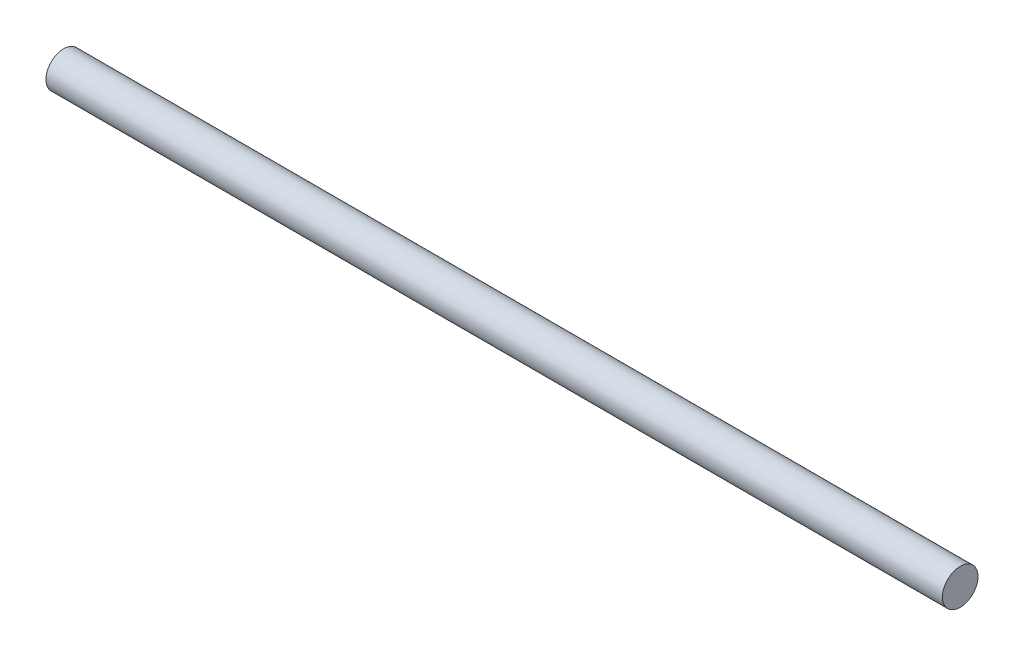
ISO-10303-21;
HEADER;
FILE_DESCRIPTION(('STEP AP214'),'2;1');
FILE_NAME('part.step','',(''),(''),'','','');
FILE_SCHEMA(('AUTOMOTIVE_DESIGN { 1 0 10303 214 1 1 1 1 }'));
ENDSEC;
DATA;
#1=APPLICATION_CONTEXT('core data for automotive mechanical design processes');
#2=APPLICATION_PROTOCOL_DEFINITION('international standard','automotive_design',2000,#1);
#3=PRODUCT_CONTEXT('',#1,'mechanical');
#4=PRODUCT('Part','Part','',(#3));
#5=PRODUCT_RELATED_PRODUCT_CATEGORY('part','',(#4));
#6=PRODUCT_DEFINITION_FORMATION('','',#4);
#7=PRODUCT_DEFINITION_CONTEXT('part definition',#1,'design');
#8=PRODUCT_DEFINITION('design','',#6,#7);
#9=PRODUCT_DEFINITION_SHAPE('','',#8);
#10=(LENGTH_UNIT() NAMED_UNIT(*) SI_UNIT(.MILLI.,.METRE.));
#11=(NAMED_UNIT(*) PLANE_ANGLE_UNIT() SI_UNIT($,.RADIAN.));
#12=(NAMED_UNIT(*) SI_UNIT($,.STERADIAN.) SOLID_ANGLE_UNIT());
#13=UNCERTAINTY_MEASURE_WITH_UNIT(LENGTH_MEASURE(1.E-05),#10,'distance_accuracy_value','');
#14=(GEOMETRIC_REPRESENTATION_CONTEXT(3) GLOBAL_UNCERTAINTY_ASSIGNED_CONTEXT((#13)) GLOBAL_UNIT_ASSIGNED_CONTEXT((#10,
#11,#12)) REPRESENTATION_CONTEXT('',''));
#15=CARTESIAN_POINT('',(0.,0.,0.));
#16=DIRECTION('',(0.,0.,1.));
#17=DIRECTION('',(1.,0.,0.));
#18=AXIS2_PLACEMENT_3D('',#15,#16,#17);
#19=CARTESIAN_POINT('',(63.,0.,0.));
#20=DIRECTION('',(-1.,0.,0.));
#21=DIRECTION('',(0.,0.,1.));
#22=AXIS2_PLACEMENT_3D('',#19,#20,#21);
#23=CYLINDRICAL_SURFACE('',#22,1.25);
#24=CARTESIAN_POINT('',(63.,0.,0.));
#25=DIRECTION('',(1.,0.,0.));
#26=DIRECTION('',(0.,0.,-1.));
#27=AXIS2_PLACEMENT_3D('',#24,#25,#26);
#28=CIRCLE('',#27,1.25);
#29=CARTESIAN_POINT('',(63.,0.,-1.25));
#30=VERTEX_POINT('',#29);
#31=EDGE_CURVE('E10',#30,#30,#28,.T.);
#32=ORIENTED_EDGE('',*,*,#31,.F.);
#33=EDGE_LOOP('',(#32));
#34=FACE_BOUND('',#33,.T.);
#35=CARTESIAN_POINT('',(0.,0.,0.));
#36=DIRECTION('',(1.,0.,0.));
#37=DIRECTION('',(0.,0.,-1.));
#38=AXIS2_PLACEMENT_3D('',#35,#36,#37);
#39=CIRCLE('',#38,1.25);
#40=CARTESIAN_POINT('',(0.,0.,-1.25));
#41=VERTEX_POINT('',#40);
#42=EDGE_CURVE('E34',#41,#41,#39,.T.);
#43=ORIENTED_EDGE('',*,*,#42,.T.);
#44=EDGE_LOOP('',(#43));
#45=FACE_BOUND('',#44,.T.);
#46=ADVANCED_FACE('F31',(#34,#45),#23,.T.);
#47=CARTESIAN_POINT('',(63.,0.,0.));
#48=DIRECTION('',(1.,0.,0.));
#49=DIRECTION('',(0.,0.,-1.));
#50=AXIS2_PLACEMENT_3D('',#47,#48,#49);
#51=PLANE('',#50);
#52=ORIENTED_EDGE('',*,*,#31,.T.);
#53=EDGE_LOOP('',(#52));
#54=FACE_BOUND('',#53,.T.);
#55=ADVANCED_FACE('F46',(#54),#51,.T.);
#56=CARTESIAN_POINT('',(0.,0.,0.));
#57=DIRECTION('',(1.,0.,0.));
#58=DIRECTION('',(0.,0.,-1.));
#59=AXIS2_PLACEMENT_3D('',#56,#57,#58);
#60=PLANE('',#59);
#61=ORIENTED_EDGE('',*,*,#42,.F.);
#62=EDGE_LOOP('',(#61));
#63=FACE_BOUND('',#62,.T.);
#64=ADVANCED_FACE('F44',(#63),#60,.F.);
#65=CLOSED_SHELL('',(#46,#55,#64));
#66=MANIFOLD_SOLID_BREP('B2',#65);
#67=ADVANCED_BREP_SHAPE_REPRESENTATION('',(#18,#66),#14);
#68=SHAPE_DEFINITION_REPRESENTATION(#9,#67);
ENDSEC;
END-ISO-10303-21;
